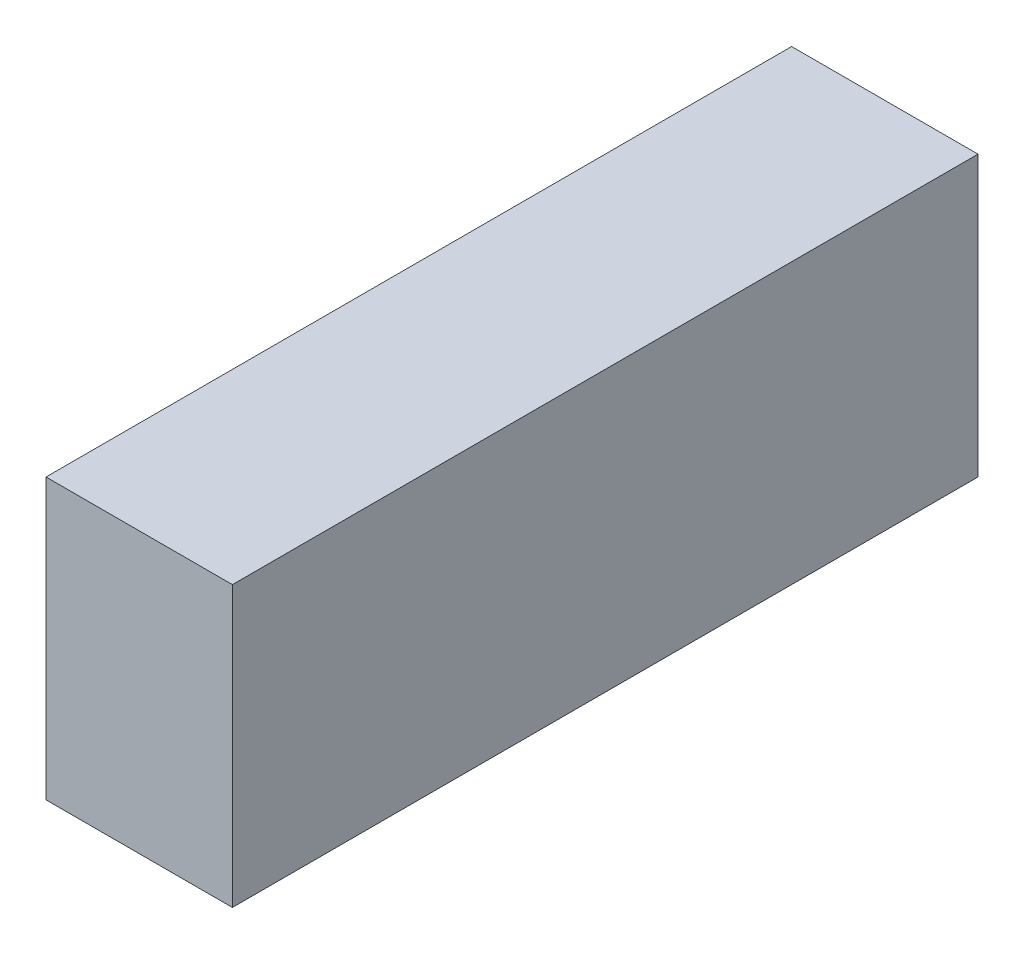
ISO-10303-21;
HEADER;
FILE_DESCRIPTION(('STEP AP214'),'2;1');
FILE_NAME('part.step','',(''),(''),'','','');
FILE_SCHEMA(('AUTOMOTIVE_DESIGN { 1 0 10303 214 1 1 1 1 }'));
ENDSEC;
DATA;
#1=APPLICATION_CONTEXT('core data for automotive mechanical design processes');
#2=APPLICATION_PROTOCOL_DEFINITION('international standard','automotive_design',2000,#1);
#3=PRODUCT_CONTEXT('',#1,'mechanical');
#4=PRODUCT('Part','Part','',(#3));
#5=PRODUCT_RELATED_PRODUCT_CATEGORY('part','',(#4));
#6=PRODUCT_DEFINITION_FORMATION('','',#4);
#7=PRODUCT_DEFINITION_CONTEXT('part definition',#1,'design');
#8=PRODUCT_DEFINITION('design','',#6,#7);
#9=PRODUCT_DEFINITION_SHAPE('','',#8);
#10=(LENGTH_UNIT() NAMED_UNIT(*) SI_UNIT(.MILLI.,.METRE.));
#11=(NAMED_UNIT(*) PLANE_ANGLE_UNIT() SI_UNIT($,.RADIAN.));
#12=(NAMED_UNIT(*) SI_UNIT($,.STERADIAN.) SOLID_ANGLE_UNIT());
#13=UNCERTAINTY_MEASURE_WITH_UNIT(LENGTH_MEASURE(1.E-05),#10,'distance_accuracy_value','');
#14=(GEOMETRIC_REPRESENTATION_CONTEXT(3) GLOBAL_UNCERTAINTY_ASSIGNED_CONTEXT((#13)) GLOBAL_UNIT_ASSIGNED_CONTEXT((#10,
#11,#12)) REPRESENTATION_CONTEXT('',''));
#15=CARTESIAN_POINT('',(0.,0.,0.));
#16=DIRECTION('',(0.,0.,1.));
#17=DIRECTION('',(1.,0.,0.));
#18=AXIS2_PLACEMENT_3D('',#15,#16,#17);
#19=CARTESIAN_POINT('',(25.4,38.1,101.6));
#20=DIRECTION('',(0.,-1.,0.));
#21=DIRECTION('',(1.,0.,0.));
#22=AXIS2_PLACEMENT_3D('',#19,#20,#21);
#23=PLANE('',#22);
#24=DIRECTION('',(-1.,0.,0.));
#25=VECTOR('',#24,1.);
#26=CARTESIAN_POINT('',(25.4,38.1,0.));
#27=LINE('',#26,#25);
#28=CARTESIAN_POINT('',(25.4,38.1,0.));
#29=VERTEX_POINT('',#28);
#30=CARTESIAN_POINT('',(0.,38.1,0.));
#31=VERTEX_POINT('',#30);
#32=EDGE_CURVE('E98',#29,#31,#27,.T.);
#33=ORIENTED_EDGE('',*,*,#32,.T.);
#34=DIRECTION('',(0.,0.,-1.));
#35=VECTOR('',#34,1.);
#36=CARTESIAN_POINT('',(0.,38.1,101.6));
#37=LINE('',#36,#35);
#38=CARTESIAN_POINT('',(0.,38.1,101.6));
#39=VERTEX_POINT('',#38);
#40=EDGE_CURVE('E11',#39,#31,#37,.T.);
#41=ORIENTED_EDGE('',*,*,#40,.F.);
#42=DIRECTION('',(-1.,0.,0.));
#43=VECTOR('',#42,1.);
#44=CARTESIAN_POINT('',(25.4,38.1,101.6));
#45=LINE('',#44,#43);
#46=CARTESIAN_POINT('',(25.4,38.1,101.6));
#47=VERTEX_POINT('',#46);
#48=EDGE_CURVE('E86',#47,#39,#45,.T.);
#49=ORIENTED_EDGE('',*,*,#48,.F.);
#50=DIRECTION('',(0.,0.,-1.));
#51=VECTOR('',#50,1.);
#52=CARTESIAN_POINT('',(25.4,38.1,101.6));
#53=LINE('',#52,#51);
#54=EDGE_CURVE('E94',#47,#29,#53,.T.);
#55=ORIENTED_EDGE('',*,*,#54,.T.);
#56=EDGE_LOOP('',(#33,#41,#49,#55));
#57=FACE_BOUND('',#56,.T.);
#58=ADVANCED_FACE('F35',(#57),#23,.F.);
#59=CARTESIAN_POINT('',(0.,38.1,101.6));
#60=DIRECTION('',(1.,0.,0.));
#61=DIRECTION('',(0.,1.,0.));
#62=AXIS2_PLACEMENT_3D('',#59,#60,#61);
#63=PLANE('',#62);
#64=DIRECTION('',(0.,-1.,0.));
#65=VECTOR('',#64,1.);
#66=CARTESIAN_POINT('',(0.,38.1,0.));
#67=LINE('',#66,#65);
#68=CARTESIAN_POINT('',(0.,0.,0.));
#69=VERTEX_POINT('',#68);
#70=EDGE_CURVE('E90',#31,#69,#67,.T.);
#71=ORIENTED_EDGE('',*,*,#70,.T.);
#72=DIRECTION('',(0.,0.,-1.));
#73=VECTOR('',#72,1.);
#74=CARTESIAN_POINT('',(0.,0.,101.6));
#75=LINE('',#74,#73);
#76=CARTESIAN_POINT('',(0.,0.,101.6));
#77=VERTEX_POINT('',#76);
#78=EDGE_CURVE('E43',#77,#69,#75,.T.);
#79=ORIENTED_EDGE('',*,*,#78,.F.);
#80=DIRECTION('',(0.,-1.,0.));
#81=VECTOR('',#80,1.);
#82=CARTESIAN_POINT('',(0.,38.1,101.6));
#83=LINE('',#82,#81);
#84=EDGE_CURVE('E81',#39,#77,#83,.T.);
#85=ORIENTED_EDGE('',*,*,#84,.F.);
#86=ORIENTED_EDGE('',*,*,#40,.T.);
#87=EDGE_LOOP('',(#71,#79,#85,#86));
#88=FACE_BOUND('',#87,.T.);
#89=ADVANCED_FACE('F89',(#88),#63,.F.);
#90=CARTESIAN_POINT('',(0.,0.,101.6));
#91=DIRECTION('',(0.,1.,0.));
#92=DIRECTION('',(0.,0.,1.));
#93=AXIS2_PLACEMENT_3D('',#90,#91,#92);
#94=PLANE('',#93);
#95=DIRECTION('',(1.,0.,0.));
#96=VECTOR('',#95,1.);
#97=CARTESIAN_POINT('',(0.,0.,0.));
#98=LINE('',#97,#96);
#99=CARTESIAN_POINT('',(25.4,0.,0.));
#100=VERTEX_POINT('',#99);
#101=EDGE_CURVE('E68',#69,#100,#98,.T.);
#102=ORIENTED_EDGE('',*,*,#101,.T.);
#103=DIRECTION('',(0.,0.,-1.));
#104=VECTOR('',#103,1.);
#105=CARTESIAN_POINT('',(25.4,0.,101.6));
#106=LINE('',#105,#104);
#107=CARTESIAN_POINT('',(25.4,0.,101.6));
#108=VERTEX_POINT('',#107);
#109=EDGE_CURVE('E91',#108,#100,#106,.T.);
#110=ORIENTED_EDGE('',*,*,#109,.F.);
#111=DIRECTION('',(1.,0.,0.));
#112=VECTOR('',#111,1.);
#113=CARTESIAN_POINT('',(0.,0.,101.6));
#114=LINE('',#113,#112);
#115=EDGE_CURVE('E84',#77,#108,#114,.T.);
#116=ORIENTED_EDGE('',*,*,#115,.F.);
#117=ORIENTED_EDGE('',*,*,#78,.T.);
#118=EDGE_LOOP('',(#102,#110,#116,#117));
#119=FACE_BOUND('',#118,.T.);
#120=ADVANCED_FACE('F92',(#119),#94,.F.);
#121=CARTESIAN_POINT('',(25.4,0.,101.6));
#122=DIRECTION('',(-1.,0.,0.));
#123=DIRECTION('',(0.,0.,1.));
#124=AXIS2_PLACEMENT_3D('',#121,#122,#123);
#125=PLANE('',#124);
#126=DIRECTION('',(0.,1.,0.));
#127=VECTOR('',#126,1.);
#128=CARTESIAN_POINT('',(25.4,0.,0.));
#129=LINE('',#128,#127);
#130=EDGE_CURVE('E74',#100,#29,#129,.T.);
#131=ORIENTED_EDGE('',*,*,#130,.T.);
#132=ORIENTED_EDGE('',*,*,#54,.F.);
#133=DIRECTION('',(0.,1.,0.));
#134=VECTOR('',#133,1.);
#135=CARTESIAN_POINT('',(25.4,0.,101.6));
#136=LINE('',#135,#134);
#137=EDGE_CURVE('E51',#108,#47,#136,.T.);
#138=ORIENTED_EDGE('',*,*,#137,.F.);
#139=ORIENTED_EDGE('',*,*,#109,.T.);
#140=EDGE_LOOP('',(#131,#132,#138,#139));
#141=FACE_BOUND('',#140,.T.);
#142=ADVANCED_FACE('F105',(#141),#125,.F.);
#143=CARTESIAN_POINT('',(0.,0.,101.6));
#144=DIRECTION('',(0.,0.,1.));
#145=DIRECTION('',(1.,0.,0.));
#146=AXIS2_PLACEMENT_3D('',#143,#144,#145);
#147=PLANE('',#146);
#148=ORIENTED_EDGE('',*,*,#48,.T.);
#149=ORIENTED_EDGE('',*,*,#84,.T.);
#150=ORIENTED_EDGE('',*,*,#115,.T.);
#151=ORIENTED_EDGE('',*,*,#137,.T.);
#152=EDGE_LOOP('',(#148,#149,#150,#151));
#153=FACE_BOUND('',#152,.T.);
#154=ADVANCED_FACE('F82',(#153),#147,.T.);
#155=CARTESIAN_POINT('',(0.,0.,0.));
#156=DIRECTION('',(0.,0.,1.));
#157=DIRECTION('',(1.,0.,0.));
#158=AXIS2_PLACEMENT_3D('',#155,#156,#157);
#159=PLANE('',#158);
#160=ORIENTED_EDGE('',*,*,#32,.F.);
#161=ORIENTED_EDGE('',*,*,#130,.F.);
#162=ORIENTED_EDGE('',*,*,#101,.F.);
#163=ORIENTED_EDGE('',*,*,#70,.F.);
#164=EDGE_LOOP('',(#160,#161,#162,#163));
#165=FACE_BOUND('',#164,.T.);
#166=ADVANCED_FACE('F108',(#165),#159,.F.);
#167=CLOSED_SHELL('',(#58,#89,#120,#142,#154,#166));
#168=MANIFOLD_SOLID_BREP('B2',#167);
#169=ADVANCED_BREP_SHAPE_REPRESENTATION('',(#18,#168),#14);
#170=SHAPE_DEFINITION_REPRESENTATION(#9,#169);
ENDSEC;
END-ISO-10303-21;
